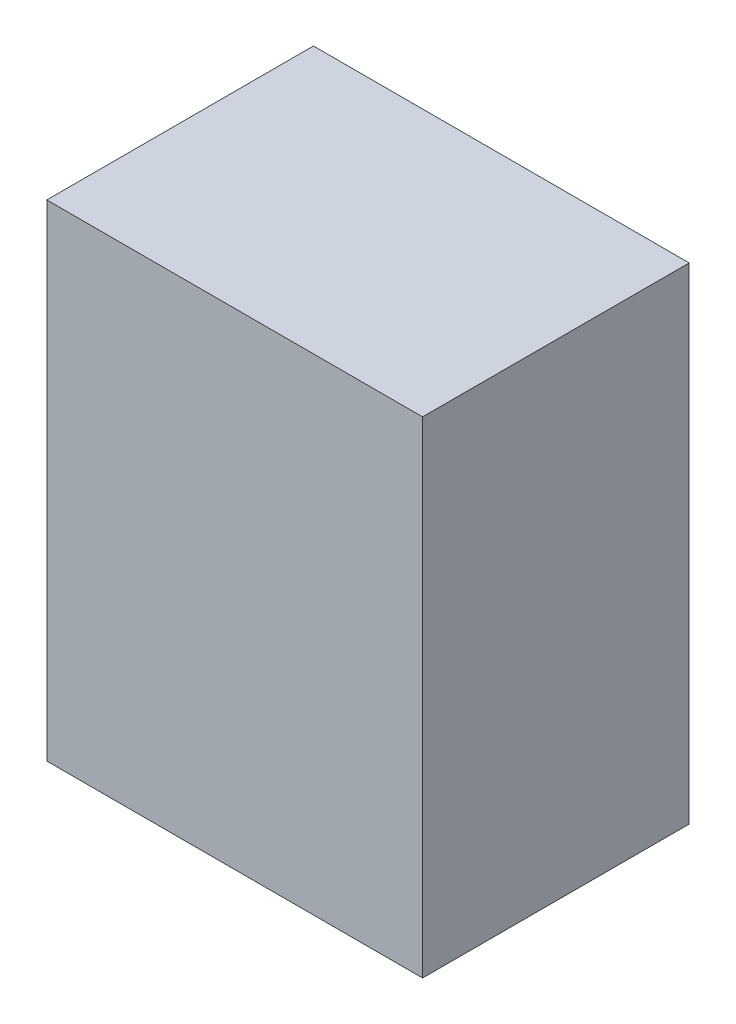
ISO-10303-21;
HEADER;
FILE_DESCRIPTION(('STEP AP214'),'2;1');
FILE_NAME('part.step','',(''),(''),'','','');
FILE_SCHEMA(('AUTOMOTIVE_DESIGN { 1 0 10303 214 1 1 1 1 }'));
ENDSEC;
DATA;
#1=APPLICATION_CONTEXT('core data for automotive mechanical design processes');
#2=APPLICATION_PROTOCOL_DEFINITION('international standard','automotive_design',2000,#1);
#3=PRODUCT_CONTEXT('',#1,'mechanical');
#4=PRODUCT('Part','Part','',(#3));
#5=PRODUCT_RELATED_PRODUCT_CATEGORY('part','',(#4));
#6=PRODUCT_DEFINITION_FORMATION('','',#4);
#7=PRODUCT_DEFINITION_CONTEXT('part definition',#1,'design');
#8=PRODUCT_DEFINITION('design','',#6,#7);
#9=PRODUCT_DEFINITION_SHAPE('','',#8);
#10=(LENGTH_UNIT() NAMED_UNIT(*) SI_UNIT(.MILLI.,.METRE.));
#11=(NAMED_UNIT(*) PLANE_ANGLE_UNIT() SI_UNIT($,.RADIAN.));
#12=(NAMED_UNIT(*) SI_UNIT($,.STERADIAN.) SOLID_ANGLE_UNIT());
#13=UNCERTAINTY_MEASURE_WITH_UNIT(LENGTH_MEASURE(1.E-05),#10,'distance_accuracy_value','');
#14=(GEOMETRIC_REPRESENTATION_CONTEXT(3) GLOBAL_UNCERTAINTY_ASSIGNED_CONTEXT((#13)) GLOBAL_UNIT_ASSIGNED_CONTEXT((#10,
#11,#12)) REPRESENTATION_CONTEXT('',''));
#15=CARTESIAN_POINT('',(0.,0.,0.));
#16=DIRECTION('',(0.,0.,1.));
#17=DIRECTION('',(1.,0.,0.));
#18=AXIS2_PLACEMENT_3D('',#15,#16,#17);
#19=CARTESIAN_POINT('',(-3.2893,6.9249798,4.6500034));
#20=DIRECTION('',(1.,0.,0.));
#21=DIRECTION('',(0.,0.,-1.));
#22=AXIS2_PLACEMENT_3D('',#19,#20,#21);
#23=PLANE('',#22);
#24=DIRECTION('',(0.,-1.,0.));
#25=VECTOR('',#24,1.);
#26=CARTESIAN_POINT('',(-3.2893,6.9249798,0.));
#27=LINE('',#26,#25);
#28=CARTESIAN_POINT('',(-3.2893,6.9249798,0.));
#29=VERTEX_POINT('',#28);
#30=CARTESIAN_POINT('',(-3.2893,-1.5502128,0.));
#31=VERTEX_POINT('',#30);
#32=EDGE_CURVE('E95',#29,#31,#27,.T.);
#33=ORIENTED_EDGE('',*,*,#32,.T.);
#34=DIRECTION('',(0.,0.,-1.));
#35=VECTOR('',#34,1.);
#36=CARTESIAN_POINT('',(-3.2893,-1.5502128,4.6500034));
#37=LINE('',#36,#35);
#38=CARTESIAN_POINT('',(-3.2893,-1.5502128,4.6500034));
#39=VERTEX_POINT('',#38);
#40=EDGE_CURVE('E11',#39,#31,#37,.T.);
#41=ORIENTED_EDGE('',*,*,#40,.F.);
#42=DIRECTION('',(0.,-1.,0.));
#43=VECTOR('',#42,1.);
#44=CARTESIAN_POINT('',(-3.2893,6.9249798,4.6500034));
#45=LINE('',#44,#43);
#46=CARTESIAN_POINT('',(-3.2893,6.9249798,4.6500034));
#47=VERTEX_POINT('',#46);
#48=EDGE_CURVE('E83',#47,#39,#45,.T.);
#49=ORIENTED_EDGE('',*,*,#48,.F.);
#50=DIRECTION('',(0.,0.,-1.));
#51=VECTOR('',#50,1.);
#52=CARTESIAN_POINT('',(-3.2893,6.9249798,4.6500034));
#53=LINE('',#52,#51);
#54=EDGE_CURVE('E91',#47,#29,#53,.T.);
#55=ORIENTED_EDGE('',*,*,#54,.T.);
#56=EDGE_LOOP('',(#33,#41,#49,#55));
#57=FACE_BOUND('',#56,.T.);
#58=ADVANCED_FACE('F32',(#57),#23,.F.);
#59=CARTESIAN_POINT('',(-3.2893,-1.5502128,4.6500034));
#60=DIRECTION('',(0.,1.,0.));
#61=DIRECTION('',(0.,0.,1.));
#62=AXIS2_PLACEMENT_3D('',#59,#60,#61);
#63=PLANE('',#62);
#64=DIRECTION('',(1.,0.,0.));
#65=VECTOR('',#64,1.);
#66=CARTESIAN_POINT('',(-3.2893,-1.5502128,0.));
#67=LINE('',#66,#65);
#68=CARTESIAN_POINT('',(3.2639,-1.5502128,0.));
#69=VERTEX_POINT('',#68);
#70=EDGE_CURVE('E87',#31,#69,#67,.T.);
#71=ORIENTED_EDGE('',*,*,#70,.T.);
#72=DIRECTION('',(0.,0.,-1.));
#73=VECTOR('',#72,1.);
#74=CARTESIAN_POINT('',(3.2639,-1.5502128,4.6500034));
#75=LINE('',#74,#73);
#76=CARTESIAN_POINT('',(3.2639,-1.5502128,4.6500034));
#77=VERTEX_POINT('',#76);
#78=EDGE_CURVE('E40',#77,#69,#75,.T.);
#79=ORIENTED_EDGE('',*,*,#78,.F.);
#80=DIRECTION('',(1.,0.,0.));
#81=VECTOR('',#80,1.);
#82=CARTESIAN_POINT('',(-3.2893,-1.5502128,4.6500034));
#83=LINE('',#82,#81);
#84=EDGE_CURVE('E78',#39,#77,#83,.T.);
#85=ORIENTED_EDGE('',*,*,#84,.F.);
#86=ORIENTED_EDGE('',*,*,#40,.T.);
#87=EDGE_LOOP('',(#71,#79,#85,#86));
#88=FACE_BOUND('',#87,.T.);
#89=ADVANCED_FACE('F86',(#88),#63,.F.);
#90=CARTESIAN_POINT('',(3.2639,-1.5502128,4.6500034));
#91=DIRECTION('',(-1.,0.,0.));
#92=DIRECTION('',(0.,0.,1.));
#93=AXIS2_PLACEMENT_3D('',#90,#91,#92);
#94=PLANE('',#93);
#95=DIRECTION('',(0.,1.,0.));
#96=VECTOR('',#95,1.);
#97=CARTESIAN_POINT('',(3.2639,-1.5502128,0.));
#98=LINE('',#97,#96);
#99=CARTESIAN_POINT('',(3.2639,6.9249798,0.));
#100=VERTEX_POINT('',#99);
#101=EDGE_CURVE('E65',#69,#100,#98,.T.);
#102=ORIENTED_EDGE('',*,*,#101,.T.);
#103=DIRECTION('',(0.,0.,-1.));
#104=VECTOR('',#103,1.);
#105=CARTESIAN_POINT('',(3.2639,6.9249798,4.6500034));
#106=LINE('',#105,#104);
#107=CARTESIAN_POINT('',(3.2639,6.9249798,4.6500034));
#108=VERTEX_POINT('',#107);
#109=EDGE_CURVE('E88',#108,#100,#106,.T.);
#110=ORIENTED_EDGE('',*,*,#109,.F.);
#111=DIRECTION('',(0.,1.,0.));
#112=VECTOR('',#111,1.);
#113=CARTESIAN_POINT('',(3.2639,-1.5502128,4.6500034));
#114=LINE('',#113,#112);
#115=EDGE_CURVE('E81',#77,#108,#114,.T.);
#116=ORIENTED_EDGE('',*,*,#115,.F.);
#117=ORIENTED_EDGE('',*,*,#78,.T.);
#118=EDGE_LOOP('',(#102,#110,#116,#117));
#119=FACE_BOUND('',#118,.T.);
#120=ADVANCED_FACE('F89',(#119),#94,.F.);
#121=CARTESIAN_POINT('',(3.2639,6.9249798,4.6500034));
#122=DIRECTION('',(0.,-1.,0.));
#123=DIRECTION('',(0.,0.,-1.));
#124=AXIS2_PLACEMENT_3D('',#121,#122,#123);
#125=PLANE('',#124);
#126=DIRECTION('',(-1.,0.,0.));
#127=VECTOR('',#126,1.);
#128=CARTESIAN_POINT('',(3.2639,6.9249798,0.));
#129=LINE('',#128,#127);
#130=EDGE_CURVE('E71',#100,#29,#129,.T.);
#131=ORIENTED_EDGE('',*,*,#130,.T.);
#132=ORIENTED_EDGE('',*,*,#54,.F.);
#133=DIRECTION('',(-1.,0.,0.));
#134=VECTOR('',#133,1.);
#135=CARTESIAN_POINT('',(3.2639,6.9249798,4.6500034));
#136=LINE('',#135,#134);
#137=EDGE_CURVE('E48',#108,#47,#136,.T.);
#138=ORIENTED_EDGE('',*,*,#137,.F.);
#139=ORIENTED_EDGE('',*,*,#109,.T.);
#140=EDGE_LOOP('',(#131,#132,#138,#139));
#141=FACE_BOUND('',#140,.T.);
#142=ADVANCED_FACE('F102',(#141),#125,.F.);
#143=CARTESIAN_POINT('',(0.,0.,4.6500034));
#144=DIRECTION('',(0.,0.,1.));
#145=DIRECTION('',(1.,0.,0.));
#146=AXIS2_PLACEMENT_3D('',#143,#144,#145);
#147=PLANE('',#146);
#148=ORIENTED_EDGE('',*,*,#48,.T.);
#149=ORIENTED_EDGE('',*,*,#84,.T.);
#150=ORIENTED_EDGE('',*,*,#115,.T.);
#151=ORIENTED_EDGE('',*,*,#137,.T.);
#152=EDGE_LOOP('',(#148,#149,#150,#151));
#153=FACE_BOUND('',#152,.T.);
#154=ADVANCED_FACE('F79',(#153),#147,.T.);
#155=CARTESIAN_POINT('',(0.,0.,0.));
#156=DIRECTION('',(0.,0.,1.));
#157=DIRECTION('',(1.,0.,0.));
#158=AXIS2_PLACEMENT_3D('',#155,#156,#157);
#159=PLANE('',#158);
#160=ORIENTED_EDGE('',*,*,#32,.F.);
#161=ORIENTED_EDGE('',*,*,#130,.F.);
#162=ORIENTED_EDGE('',*,*,#101,.F.);
#163=ORIENTED_EDGE('',*,*,#70,.F.);
#164=EDGE_LOOP('',(#160,#161,#162,#163));
#165=FACE_BOUND('',#164,.T.);
#166=ADVANCED_FACE('F105',(#165),#159,.F.);
#167=CLOSED_SHELL('',(#58,#89,#120,#142,#154,#166));
#168=MANIFOLD_SOLID_BREP('B2',#167);
#169=ADVANCED_BREP_SHAPE_REPRESENTATION('',(#18,#168),#14);
#170=SHAPE_DEFINITION_REPRESENTATION(#9,#169);
ENDSEC;
END-ISO-10303-21;
